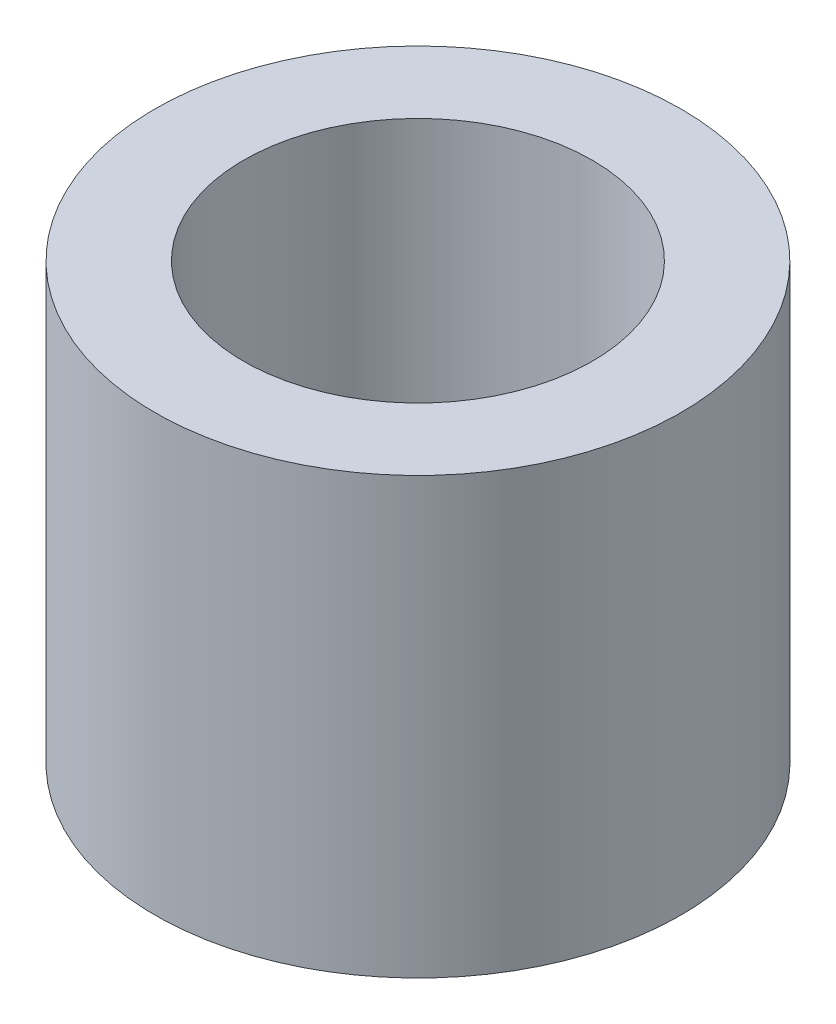
ISO-10303-21;
HEADER;
FILE_DESCRIPTION(('STEP AP214'),'2;1');
FILE_NAME('part.step','',(''),(''),'','','');
FILE_SCHEMA(('AUTOMOTIVE_DESIGN { 1 0 10303 214 1 1 1 1 }'));
ENDSEC;
DATA;
#1=APPLICATION_CONTEXT('core data for automotive mechanical design processes');
#2=APPLICATION_PROTOCOL_DEFINITION('international standard','automotive_design',2000,#1);
#3=PRODUCT_CONTEXT('',#1,'mechanical');
#4=PRODUCT('Part','Part','',(#3));
#5=PRODUCT_RELATED_PRODUCT_CATEGORY('part','',(#4));
#6=PRODUCT_DEFINITION_FORMATION('','',#4);
#7=PRODUCT_DEFINITION_CONTEXT('part definition',#1,'design');
#8=PRODUCT_DEFINITION('design','',#6,#7);
#9=PRODUCT_DEFINITION_SHAPE('','',#8);
#10=(LENGTH_UNIT() NAMED_UNIT(*) SI_UNIT(.MILLI.,.METRE.));
#11=(NAMED_UNIT(*) PLANE_ANGLE_UNIT() SI_UNIT($,.RADIAN.));
#12=(NAMED_UNIT(*) SI_UNIT($,.STERADIAN.) SOLID_ANGLE_UNIT());
#13=UNCERTAINTY_MEASURE_WITH_UNIT(LENGTH_MEASURE(1.E-05),#10,'distance_accuracy_value','');
#14=(GEOMETRIC_REPRESENTATION_CONTEXT(3) GLOBAL_UNCERTAINTY_ASSIGNED_CONTEXT((#13)) GLOBAL_UNIT_ASSIGNED_CONTEXT((#10,
#11,#12)) REPRESENTATION_CONTEXT('',''));
#15=CARTESIAN_POINT('',(0.,0.,0.));
#16=DIRECTION('',(0.,0.,1.));
#17=DIRECTION('',(1.,0.,0.));
#18=AXIS2_PLACEMENT_3D('',#15,#16,#17);
#19=CARTESIAN_POINT('',(0.,21.1,0.));
#20=DIRECTION('',(0.,-1.,0.));
#21=DIRECTION('',(0.,0.,-1.));
#22=AXIS2_PLACEMENT_3D('',#19,#20,#21);
#23=CYLINDRICAL_SURFACE('',#22,8.45);
#24=CARTESIAN_POINT('',(0.,0.,0.));
#25=DIRECTION('',(0.,-1.,0.));
#26=DIRECTION('',(0.,0.,-1.));
#27=AXIS2_PLACEMENT_3D('',#24,#25,#26);
#28=CIRCLE('',#27,8.45);
#29=CARTESIAN_POINT('',(0.,0.,-8.45));
#30=VERTEX_POINT('',#29);
#31=EDGE_CURVE('E27',#30,#30,#28,.T.);
#32=ORIENTED_EDGE('',*,*,#31,.T.);
#33=EDGE_LOOP('',(#32));
#34=FACE_BOUND('',#33,.T.);
#35=CARTESIAN_POINT('',(0.,21.1,0.));
#36=DIRECTION('',(0.,-1.,0.));
#37=DIRECTION('',(0.,0.,-1.));
#38=AXIS2_PLACEMENT_3D('',#35,#36,#37);
#39=CIRCLE('',#38,8.45);
#40=CARTESIAN_POINT('',(0.,21.1,-8.45));
#41=VERTEX_POINT('',#40);
#42=EDGE_CURVE('E18',#41,#41,#39,.T.);
#43=ORIENTED_EDGE('',*,*,#42,.F.);
#44=EDGE_LOOP('',(#43));
#45=FACE_BOUND('',#44,.T.);
#46=ADVANCED_FACE('F15',(#34,#45),#23,.F.);
#47=CARTESIAN_POINT('',(0.,21.1,0.));
#48=DIRECTION('',(0.,1.,0.));
#49=DIRECTION('',(0.,0.,1.));
#50=AXIS2_PLACEMENT_3D('',#47,#48,#49);
#51=PLANE('',#50);
#52=ORIENTED_EDGE('',*,*,#42,.T.);
#53=EDGE_LOOP('',(#52));
#54=FACE_BOUND('',#53,.T.);
#55=CARTESIAN_POINT('',(0.,21.1,0.));
#56=DIRECTION('',(0.,-1.,0.));
#57=DIRECTION('',(0.,0.,-1.));
#58=AXIS2_PLACEMENT_3D('',#55,#56,#57);
#59=CIRCLE('',#58,12.75);
#60=CARTESIAN_POINT('',(0.,21.1,-12.75));
#61=VERTEX_POINT('',#60);
#62=EDGE_CURVE('E22',#61,#61,#59,.T.);
#63=ORIENTED_EDGE('',*,*,#62,.F.);
#64=EDGE_LOOP('',(#63));
#65=FACE_BOUND('',#64,.T.);
#66=ADVANCED_FACE('F35',(#54,#65),#51,.T.);
#67=CARTESIAN_POINT('',(0.,0.,0.));
#68=DIRECTION('',(0.,1.,0.));
#69=DIRECTION('',(0.,0.,1.));
#70=AXIS2_PLACEMENT_3D('',#67,#68,#69);
#71=PLANE('',#70);
#72=ORIENTED_EDGE('',*,*,#31,.F.);
#73=EDGE_LOOP('',(#72));
#74=FACE_BOUND('',#73,.T.);
#75=CARTESIAN_POINT('',(0.,0.,0.));
#76=DIRECTION('',(0.,-1.,0.));
#77=DIRECTION('',(0.,0.,-1.));
#78=AXIS2_PLACEMENT_3D('',#75,#76,#77);
#79=CIRCLE('',#78,12.75);
#80=CARTESIAN_POINT('',(0.,0.,-12.75));
#81=VERTEX_POINT('',#80);
#82=EDGE_CURVE('E10',#81,#81,#79,.F.);
#83=ORIENTED_EDGE('',*,*,#82,.F.);
#84=EDGE_LOOP('',(#83));
#85=FACE_BOUND('',#84,.T.);
#86=ADVANCED_FACE('F43',(#74,#85),#71,.F.);
#87=CARTESIAN_POINT('',(0.,21.1,0.));
#88=DIRECTION('',(0.,-1.,0.));
#89=DIRECTION('',(0.,0.,-1.));
#90=AXIS2_PLACEMENT_3D('',#87,#88,#89);
#91=CYLINDRICAL_SURFACE('',#90,12.75);
#92=ORIENTED_EDGE('',*,*,#82,.T.);
#93=EDGE_LOOP('',(#92));
#94=FACE_BOUND('',#93,.T.);
#95=ORIENTED_EDGE('',*,*,#62,.T.);
#96=EDGE_LOOP('',(#95));
#97=FACE_BOUND('',#96,.T.);
#98=ADVANCED_FACE('F44',(#94,#97),#91,.T.);
#99=CLOSED_SHELL('',(#46,#66,#86,#98));
#100=MANIFOLD_SOLID_BREP('B1',#99);
#101=ADVANCED_BREP_SHAPE_REPRESENTATION('',(#18,#100),#14);
#102=SHAPE_DEFINITION_REPRESENTATION(#9,#101);
ENDSEC;
END-ISO-10303-21;
